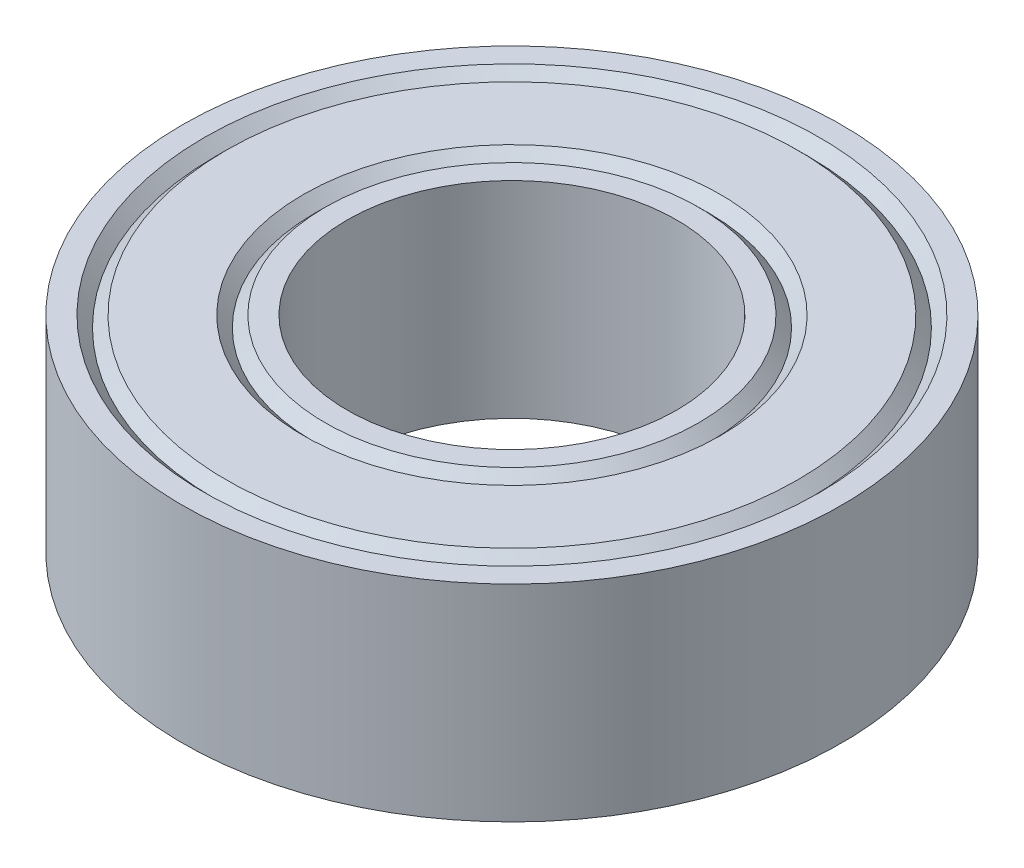
ISO-10303-21;
HEADER;
FILE_DESCRIPTION(('STEP AP214'),'2;1');
FILE_NAME('part.step','',(''),(''),'','','');
FILE_SCHEMA(('AUTOMOTIVE_DESIGN { 1 0 10303 214 1 1 1 1 }'));
ENDSEC;
DATA;
#1=APPLICATION_CONTEXT('core data for automotive mechanical design processes');
#2=APPLICATION_PROTOCOL_DEFINITION('international standard','automotive_design',2000,#1);
#3=PRODUCT_CONTEXT('',#1,'mechanical');
#4=PRODUCT('Part','Part','',(#3));
#5=PRODUCT_RELATED_PRODUCT_CATEGORY('part','',(#4));
#6=PRODUCT_DEFINITION_FORMATION('','',#4);
#7=PRODUCT_DEFINITION_CONTEXT('part definition',#1,'design');
#8=PRODUCT_DEFINITION('design','',#6,#7);
#9=PRODUCT_DEFINITION_SHAPE('','',#8);
#10=(LENGTH_UNIT() NAMED_UNIT(*) SI_UNIT(.MILLI.,.METRE.));
#11=(NAMED_UNIT(*) PLANE_ANGLE_UNIT() SI_UNIT($,.RADIAN.));
#12=(NAMED_UNIT(*) SI_UNIT($,.STERADIAN.) SOLID_ANGLE_UNIT());
#13=UNCERTAINTY_MEASURE_WITH_UNIT(LENGTH_MEASURE(1.E-05),#10,'distance_accuracy_value','');
#14=(GEOMETRIC_REPRESENTATION_CONTEXT(3) GLOBAL_UNCERTAINTY_ASSIGNED_CONTEXT((#13)) GLOBAL_UNIT_ASSIGNED_CONTEXT((#10,
#11,#12)) REPRESENTATION_CONTEXT('',''));
#15=CARTESIAN_POINT('',(0.,0.,0.));
#16=DIRECTION('',(0.,0.,1.));
#17=DIRECTION('',(1.,0.,0.));
#18=AXIS2_PLACEMENT_3D('',#15,#16,#17);
#19=CARTESIAN_POINT('',(0.,2.5,0.));
#20=DIRECTION('',(0.,1.,0.));
#21=DIRECTION('',(-1.,0.,0.));
#22=AXIS2_PLACEMENT_3D('',#19,#20,#21);
#23=CYLINDRICAL_SURFACE('',#22,4.);
#24=CARTESIAN_POINT('',(0.,2.49999999999998,0.));
#25=DIRECTION('',(0.,1.,0.));
#26=DIRECTION('',(-1.,0.,0.));
#27=AXIS2_PLACEMENT_3D('',#24,#25,#26);
#28=CIRCLE('',#27,4.);
#29=CARTESIAN_POINT('',(-4.,2.49999999999998,0.));
#30=VERTEX_POINT('',#29);
#31=EDGE_CURVE('E82',#30,#30,#28,.T.);
#32=ORIENTED_EDGE('',*,*,#31,.T.);
#33=EDGE_LOOP('',(#32));
#34=FACE_BOUND('',#33,.T.);
#35=CARTESIAN_POINT('',(0.,-2.49999999999998,0.));
#36=DIRECTION('',(0.,1.,0.));
#37=DIRECTION('',(-1.,0.,0.));
#38=AXIS2_PLACEMENT_3D('',#35,#36,#37);
#39=CIRCLE('',#38,4.);
#40=CARTESIAN_POINT('',(-4.,-2.49999999999998,0.));
#41=VERTEX_POINT('',#40);
#42=EDGE_CURVE('E10',#41,#41,#39,.T.);
#43=ORIENTED_EDGE('',*,*,#42,.F.);
#44=EDGE_LOOP('',(#43));
#45=FACE_BOUND('',#44,.T.);
#46=ADVANCED_FACE('F30',(#34,#45),#23,.F.);
#47=CARTESIAN_POINT('',(-4.,-2.49999999999999,0.));
#48=DIRECTION('',(0.,-1.,0.));
#49=DIRECTION('',(1.,0.,0.));
#50=AXIS2_PLACEMENT_3D('',#47,#48,#49);
#51=PLANE('',#50);
#52=ORIENTED_EDGE('',*,*,#42,.T.);
#53=EDGE_LOOP('',(#52));
#54=FACE_BOUND('',#53,.T.);
#55=CARTESIAN_POINT('',(0.,-2.5,0.));
#56=DIRECTION('',(0.,1.,0.));
#57=DIRECTION('',(-1.,0.,0.));
#58=AXIS2_PLACEMENT_3D('',#55,#56,#57);
#59=CIRCLE('',#58,4.53333333333333);
#60=CARTESIAN_POINT('',(-4.53333333333333,-2.5,0.));
#61=VERTEX_POINT('',#60);
#62=EDGE_CURVE('E36',#61,#61,#59,.T.);
#63=ORIENTED_EDGE('',*,*,#62,.F.);
#64=EDGE_LOOP('',(#63));
#65=FACE_BOUND('',#64,.T.);
#66=ADVANCED_FACE('F100',(#54,#65),#51,.T.);
#67=CARTESIAN_POINT('',(0.,-2.23333333333333,0.));
#68=DIRECTION('',(0.,1.,0.));
#69=DIRECTION('',(-1.,0.,0.));
#70=AXIS2_PLACEMENT_3D('',#67,#68,#69);
#71=CONICAL_SURFACE('',#70,4.8,0.785398163397448);
#72=ORIENTED_EDGE('',*,*,#62,.T.);
#73=EDGE_LOOP('',(#72));
#74=FACE_BOUND('',#73,.T.);
#75=CARTESIAN_POINT('',(0.,-2.23333333333333,0.));
#76=DIRECTION('',(0.,1.,0.));
#77=DIRECTION('',(-1.,0.,0.));
#78=AXIS2_PLACEMENT_3D('',#75,#76,#77);
#79=CIRCLE('',#78,4.8);
#80=CARTESIAN_POINT('',(-4.8,-2.23333333333333,0.));
#81=VERTEX_POINT('',#80);
#82=EDGE_CURVE('E40',#81,#81,#79,.T.);
#83=ORIENTED_EDGE('',*,*,#82,.F.);
#84=EDGE_LOOP('',(#83));
#85=FACE_BOUND('',#84,.T.);
#86=ADVANCED_FACE('F104',(#74,#85),#71,.T.);
#87=CARTESIAN_POINT('',(0.,-2.5,0.));
#88=DIRECTION('',(0.,-1.,0.));
#89=DIRECTION('',(1.,0.,0.));
#90=AXIS2_PLACEMENT_3D('',#87,#88,#89);
#91=CONICAL_SURFACE('',#90,5.06666666666667,0.785398163397452);
#92=ORIENTED_EDGE('',*,*,#82,.T.);
#93=EDGE_LOOP('',(#92));
#94=FACE_BOUND('',#93,.T.);
#95=CARTESIAN_POINT('',(0.,-2.5,0.));
#96=DIRECTION('',(0.,1.,0.));
#97=DIRECTION('',(-1.,0.,0.));
#98=AXIS2_PLACEMENT_3D('',#95,#96,#97);
#99=CIRCLE('',#98,5.06666666666667);
#100=CARTESIAN_POINT('',(-5.06666666666667,-2.5,0.));
#101=VERTEX_POINT('',#100);
#102=EDGE_CURVE('E44',#101,#101,#99,.T.);
#103=ORIENTED_EDGE('',*,*,#102,.F.);
#104=EDGE_LOOP('',(#103));
#105=FACE_BOUND('',#104,.T.);
#106=ADVANCED_FACE('F108',(#94,#105),#91,.F.);
#107=CARTESIAN_POINT('',(-5.06666666666667,-2.5,0.));
#108=DIRECTION('',(0.,-1.,0.));
#109=DIRECTION('',(1.,0.,0.));
#110=AXIS2_PLACEMENT_3D('',#107,#108,#109);
#111=PLANE('',#110);
#112=ORIENTED_EDGE('',*,*,#102,.T.);
#113=EDGE_LOOP('',(#112));
#114=FACE_BOUND('',#113,.T.);
#115=CARTESIAN_POINT('',(0.,-2.5,0.));
#116=DIRECTION('',(0.,1.,0.));
#117=DIRECTION('',(-1.,0.,0.));
#118=AXIS2_PLACEMENT_3D('',#115,#116,#117);
#119=CIRCLE('',#118,6.93333333333332);
#120=CARTESIAN_POINT('',(-6.93333333333332,-2.5,0.));
#121=VERTEX_POINT('',#120);
#122=EDGE_CURVE('E49',#121,#121,#119,.T.);
#123=ORIENTED_EDGE('',*,*,#122,.F.);
#124=EDGE_LOOP('',(#123));
#125=FACE_BOUND('',#124,.T.);
#126=ADVANCED_FACE('F114',(#114,#125),#111,.T.);
#127=CARTESIAN_POINT('',(0.,-2.23333333333333,0.));
#128=DIRECTION('',(0.,1.,0.));
#129=DIRECTION('',(-1.,0.,0.));
#130=AXIS2_PLACEMENT_3D('',#127,#128,#129);
#131=CONICAL_SURFACE('',#130,7.2,0.785398163397468);
#132=ORIENTED_EDGE('',*,*,#122,.T.);
#133=EDGE_LOOP('',(#132));
#134=FACE_BOUND('',#133,.T.);
#135=CARTESIAN_POINT('',(0.,-2.23333333333333,0.));
#136=DIRECTION('',(0.,1.,0.));
#137=DIRECTION('',(-1.,0.,0.));
#138=AXIS2_PLACEMENT_3D('',#135,#136,#137);
#139=CIRCLE('',#138,7.2);
#140=CARTESIAN_POINT('',(-7.2,-2.23333333333333,0.));
#141=VERTEX_POINT('',#140);
#142=EDGE_CURVE('E52',#141,#141,#139,.T.);
#143=ORIENTED_EDGE('',*,*,#142,.F.);
#144=EDGE_LOOP('',(#143));
#145=FACE_BOUND('',#144,.T.);
#146=ADVANCED_FACE('F118',(#134,#145),#131,.T.);
#147=CARTESIAN_POINT('',(0.,-2.5,0.));
#148=DIRECTION('',(0.,-1.,0.));
#149=DIRECTION('',(1.,0.,0.));
#150=AXIS2_PLACEMENT_3D('',#147,#148,#149);
#151=CONICAL_SURFACE('',#150,7.46666666666667,0.785398163397447);
#152=ORIENTED_EDGE('',*,*,#142,.T.);
#153=EDGE_LOOP('',(#152));
#154=FACE_BOUND('',#153,.T.);
#155=CARTESIAN_POINT('',(0.,-2.5,0.));
#156=DIRECTION('',(0.,1.,0.));
#157=DIRECTION('',(-1.,0.,0.));
#158=AXIS2_PLACEMENT_3D('',#155,#156,#157);
#159=CIRCLE('',#158,7.46666666666667);
#160=CARTESIAN_POINT('',(-7.46666666666667,-2.5,0.));
#161=VERTEX_POINT('',#160);
#162=EDGE_CURVE('E55',#161,#161,#159,.T.);
#163=ORIENTED_EDGE('',*,*,#162,.F.);
#164=EDGE_LOOP('',(#163));
#165=FACE_BOUND('',#164,.T.);
#166=ADVANCED_FACE('F122',(#154,#165),#151,.F.);
#167=CARTESIAN_POINT('',(-7.46666666666667,-2.5,0.));
#168=DIRECTION('',(0.,-1.,0.));
#169=DIRECTION('',(1.,0.,0.));
#170=AXIS2_PLACEMENT_3D('',#167,#168,#169);
#171=PLANE('',#170);
#172=ORIENTED_EDGE('',*,*,#162,.T.);
#173=EDGE_LOOP('',(#172));
#174=FACE_BOUND('',#173,.T.);
#175=CARTESIAN_POINT('',(0.,-2.5,0.));
#176=DIRECTION('',(0.,1.,0.));
#177=DIRECTION('',(-1.,0.,0.));
#178=AXIS2_PLACEMENT_3D('',#175,#176,#177);
#179=CIRCLE('',#178,8.);
#180=CARTESIAN_POINT('',(-8.,-2.5,0.));
#181=VERTEX_POINT('',#180);
#182=EDGE_CURVE('E58',#181,#181,#179,.T.);
#183=ORIENTED_EDGE('',*,*,#182,.F.);
#184=EDGE_LOOP('',(#183));
#185=FACE_BOUND('',#184,.T.);
#186=ADVANCED_FACE('F126',(#174,#185),#171,.T.);
#187=CARTESIAN_POINT('',(0.,2.5,0.));
#188=DIRECTION('',(0.,1.,0.));
#189=DIRECTION('',(-1.,0.,0.));
#190=AXIS2_PLACEMENT_3D('',#187,#188,#189);
#191=CYLINDRICAL_SURFACE('',#190,8.);
#192=ORIENTED_EDGE('',*,*,#182,.T.);
#193=EDGE_LOOP('',(#192));
#194=FACE_BOUND('',#193,.T.);
#195=CARTESIAN_POINT('',(0.,2.5,0.));
#196=DIRECTION('',(0.,1.,0.));
#197=DIRECTION('',(-1.,0.,0.));
#198=AXIS2_PLACEMENT_3D('',#195,#196,#197);
#199=CIRCLE('',#198,8.);
#200=CARTESIAN_POINT('',(-8.,2.5,0.));
#201=VERTEX_POINT('',#200);
#202=EDGE_CURVE('E61',#201,#201,#199,.T.);
#203=ORIENTED_EDGE('',*,*,#202,.F.);
#204=EDGE_LOOP('',(#203));
#205=FACE_BOUND('',#204,.T.);
#206=ADVANCED_FACE('F130',(#194,#205),#191,.T.);
#207=CARTESIAN_POINT('',(-7.46666666666667,2.5,0.));
#208=DIRECTION('',(0.,1.,0.));
#209=DIRECTION('',(-1.,0.,0.));
#210=AXIS2_PLACEMENT_3D('',#207,#208,#209);
#211=PLANE('',#210);
#212=ORIENTED_EDGE('',*,*,#202,.T.);
#213=EDGE_LOOP('',(#212));
#214=FACE_BOUND('',#213,.T.);
#215=CARTESIAN_POINT('',(0.,2.5,0.));
#216=DIRECTION('',(0.,1.,0.));
#217=DIRECTION('',(-1.,0.,0.));
#218=AXIS2_PLACEMENT_3D('',#215,#216,#217);
#219=CIRCLE('',#218,7.46666666666667);
#220=CARTESIAN_POINT('',(-7.46666666666667,2.5,0.));
#221=VERTEX_POINT('',#220);
#222=EDGE_CURVE('E64',#221,#221,#219,.T.);
#223=ORIENTED_EDGE('',*,*,#222,.F.);
#224=EDGE_LOOP('',(#223));
#225=FACE_BOUND('',#224,.T.);
#226=ADVANCED_FACE('F134',(#214,#225),#211,.T.);
#227=CARTESIAN_POINT('',(0.,2.23333333333333,0.));
#228=DIRECTION('',(0.,1.,0.));
#229=DIRECTION('',(-1.,0.,0.));
#230=AXIS2_PLACEMENT_3D('',#227,#228,#229);
#231=CONICAL_SURFACE('',#230,7.2,0.78539816339745);
#232=ORIENTED_EDGE('',*,*,#222,.T.);
#233=EDGE_LOOP('',(#232));
#234=FACE_BOUND('',#233,.T.);
#235=CARTESIAN_POINT('',(0.,2.23333333333333,0.));
#236=DIRECTION('',(0.,1.,0.));
#237=DIRECTION('',(-1.,0.,0.));
#238=AXIS2_PLACEMENT_3D('',#235,#236,#237);
#239=CIRCLE('',#238,7.2);
#240=CARTESIAN_POINT('',(-7.2,2.23333333333333,0.));
#241=VERTEX_POINT('',#240);
#242=EDGE_CURVE('E67',#241,#241,#239,.T.);
#243=ORIENTED_EDGE('',*,*,#242,.F.);
#244=EDGE_LOOP('',(#243));
#245=FACE_BOUND('',#244,.T.);
#246=ADVANCED_FACE('F138',(#234,#245),#231,.F.);
#247=CARTESIAN_POINT('',(0.,2.5,0.));
#248=DIRECTION('',(0.,-1.,0.));
#249=DIRECTION('',(1.,0.,0.));
#250=AXIS2_PLACEMENT_3D('',#247,#248,#249);
#251=CONICAL_SURFACE('',#250,6.93333333333332,0.785398163397466);
#252=ORIENTED_EDGE('',*,*,#242,.T.);
#253=EDGE_LOOP('',(#252));
#254=FACE_BOUND('',#253,.T.);
#255=CARTESIAN_POINT('',(0.,2.5,0.));
#256=DIRECTION('',(0.,1.,0.));
#257=DIRECTION('',(-1.,0.,0.));
#258=AXIS2_PLACEMENT_3D('',#255,#256,#257);
#259=CIRCLE('',#258,6.93333333333332);
#260=CARTESIAN_POINT('',(-6.93333333333332,2.5,0.));
#261=VERTEX_POINT('',#260);
#262=EDGE_CURVE('E70',#261,#261,#259,.T.);
#263=ORIENTED_EDGE('',*,*,#262,.F.);
#264=EDGE_LOOP('',(#263));
#265=FACE_BOUND('',#264,.T.);
#266=ADVANCED_FACE('F142',(#254,#265),#251,.T.);
#267=CARTESIAN_POINT('',(-5.06666666666667,2.5,0.));
#268=DIRECTION('',(0.,1.,0.));
#269=DIRECTION('',(-1.,0.,0.));
#270=AXIS2_PLACEMENT_3D('',#267,#268,#269);
#271=PLANE('',#270);
#272=ORIENTED_EDGE('',*,*,#262,.T.);
#273=EDGE_LOOP('',(#272));
#274=FACE_BOUND('',#273,.T.);
#275=CARTESIAN_POINT('',(0.,2.5,0.));
#276=DIRECTION('',(0.,1.,0.));
#277=DIRECTION('',(-1.,0.,0.));
#278=AXIS2_PLACEMENT_3D('',#275,#276,#277);
#279=CIRCLE('',#278,5.06666666666667);
#280=CARTESIAN_POINT('',(-5.06666666666667,2.5,0.));
#281=VERTEX_POINT('',#280);
#282=EDGE_CURVE('E73',#281,#281,#279,.T.);
#283=ORIENTED_EDGE('',*,*,#282,.F.);
#284=EDGE_LOOP('',(#283));
#285=FACE_BOUND('',#284,.T.);
#286=ADVANCED_FACE('F146',(#274,#285),#271,.T.);
#287=CARTESIAN_POINT('',(0.,2.23333333333333,0.));
#288=DIRECTION('',(0.,1.,0.));
#289=DIRECTION('',(-1.,0.,0.));
#290=AXIS2_PLACEMENT_3D('',#287,#288,#289);
#291=CONICAL_SURFACE('',#290,4.8,0.785398163397449);
#292=ORIENTED_EDGE('',*,*,#282,.T.);
#293=EDGE_LOOP('',(#292));
#294=FACE_BOUND('',#293,.T.);
#295=CARTESIAN_POINT('',(0.,2.23333333333333,0.));
#296=DIRECTION('',(0.,1.,0.));
#297=DIRECTION('',(-1.,0.,0.));
#298=AXIS2_PLACEMENT_3D('',#295,#296,#297);
#299=CIRCLE('',#298,4.8);
#300=CARTESIAN_POINT('',(-4.8,2.23333333333333,0.));
#301=VERTEX_POINT('',#300);
#302=EDGE_CURVE('E76',#301,#301,#299,.T.);
#303=ORIENTED_EDGE('',*,*,#302,.F.);
#304=EDGE_LOOP('',(#303));
#305=FACE_BOUND('',#304,.T.);
#306=ADVANCED_FACE('F96',(#294,#305),#291,.F.);
#307=CARTESIAN_POINT('',(0.,2.5,0.));
#308=DIRECTION('',(0.,-1.,0.));
#309=DIRECTION('',(1.,0.,0.));
#310=AXIS2_PLACEMENT_3D('',#307,#308,#309);
#311=CONICAL_SURFACE('',#310,4.53333333333333,0.785398163397444);
#312=ORIENTED_EDGE('',*,*,#302,.T.);
#313=EDGE_LOOP('',(#312));
#314=FACE_BOUND('',#313,.T.);
#315=CARTESIAN_POINT('',(0.,2.5,0.));
#316=DIRECTION('',(0.,1.,0.));
#317=DIRECTION('',(-1.,0.,0.));
#318=AXIS2_PLACEMENT_3D('',#315,#316,#317);
#319=CIRCLE('',#318,4.53333333333333);
#320=CARTESIAN_POINT('',(-4.53333333333333,2.5,0.));
#321=VERTEX_POINT('',#320);
#322=EDGE_CURVE('E79',#321,#321,#319,.T.);
#323=ORIENTED_EDGE('',*,*,#322,.F.);
#324=EDGE_LOOP('',(#323));
#325=FACE_BOUND('',#324,.T.);
#326=ADVANCED_FACE('F90',(#314,#325),#311,.T.);
#327=CARTESIAN_POINT('',(-4.,2.49999999999999,0.));
#328=DIRECTION('',(0.,1.,0.));
#329=DIRECTION('',(-1.,0.,0.));
#330=AXIS2_PLACEMENT_3D('',#327,#328,#329);
#331=PLANE('',#330);
#332=ORIENTED_EDGE('',*,*,#322,.T.);
#333=EDGE_LOOP('',(#332));
#334=FACE_BOUND('',#333,.T.);
#335=ORIENTED_EDGE('',*,*,#31,.F.);
#336=EDGE_LOOP('',(#335));
#337=FACE_BOUND('',#336,.T.);
#338=ADVANCED_FACE('F88',(#334,#337),#331,.T.);
#339=CLOSED_SHELL('',(#46,#66,#86,#106,#126,#146,#166,#186,#206,#226,#246,#266,#286,#306,#326,#338));
#340=MANIFOLD_SOLID_BREP('B2',#339);
#341=ADVANCED_BREP_SHAPE_REPRESENTATION('',(#18,#340),#14);
#342=SHAPE_DEFINITION_REPRESENTATION(#9,#341);
ENDSEC;
END-ISO-10303-21;
